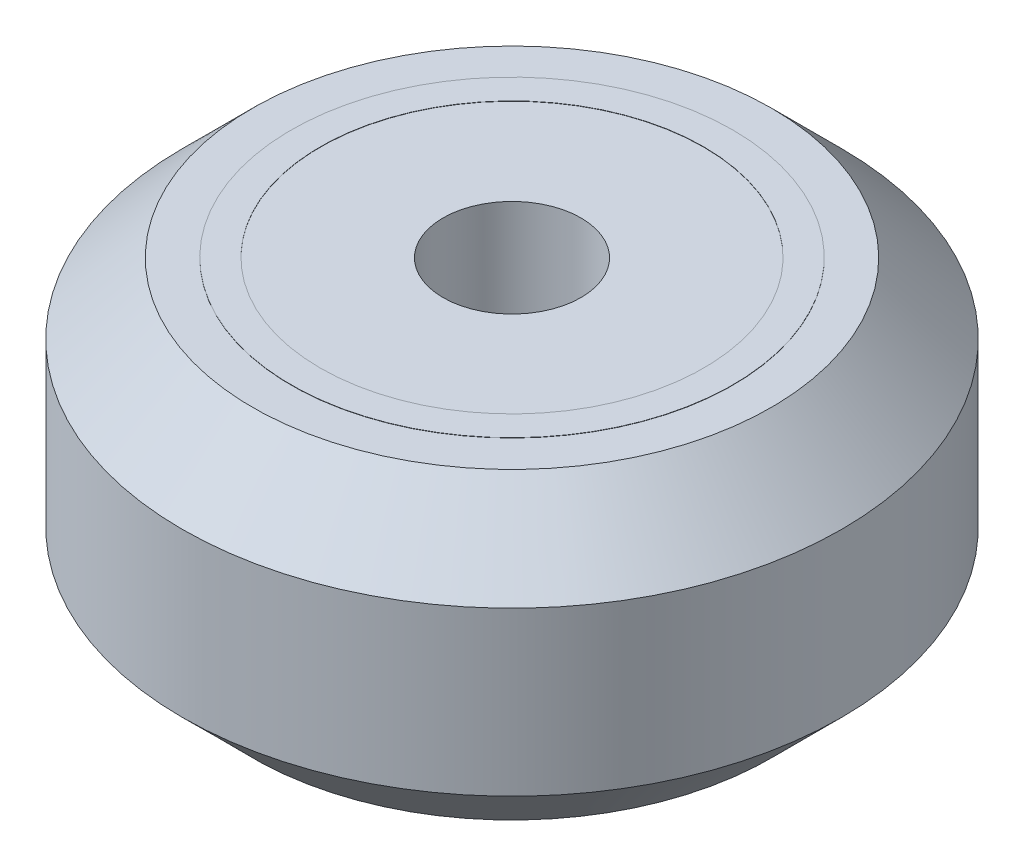
ISO-10303-21;
HEADER;
FILE_DESCRIPTION(('STEP AP214'),'2;1');
FILE_NAME('part.step','',(''),(''),'','','');
FILE_SCHEMA(('AUTOMOTIVE_DESIGN { 1 0 10303 214 1 1 1 1 }'));
ENDSEC;
DATA;
#1=APPLICATION_CONTEXT('core data for automotive mechanical design processes');
#2=APPLICATION_PROTOCOL_DEFINITION('international standard','automotive_design',2000,#1);
#3=PRODUCT_CONTEXT('',#1,'mechanical');
#4=PRODUCT('Part','Part','',(#3));
#5=PRODUCT_RELATED_PRODUCT_CATEGORY('part','',(#4));
#6=PRODUCT_DEFINITION_FORMATION('','',#4);
#7=PRODUCT_DEFINITION_CONTEXT('part definition',#1,'design');
#8=PRODUCT_DEFINITION('design','',#6,#7);
#9=PRODUCT_DEFINITION_SHAPE('','',#8);
#10=(LENGTH_UNIT() NAMED_UNIT(*) SI_UNIT(.MILLI.,.METRE.));
#11=(NAMED_UNIT(*) PLANE_ANGLE_UNIT() SI_UNIT($,.RADIAN.));
#12=(NAMED_UNIT(*) SI_UNIT($,.STERADIAN.) SOLID_ANGLE_UNIT());
#13=UNCERTAINTY_MEASURE_WITH_UNIT(LENGTH_MEASURE(1.E-05),#10,'distance_accuracy_value','');
#14=(GEOMETRIC_REPRESENTATION_CONTEXT(3) GLOBAL_UNCERTAINTY_ASSIGNED_CONTEXT((#13)) GLOBAL_UNIT_ASSIGNED_CONTEXT((#10,
#11,#12)) REPRESENTATION_CONTEXT('',''));
#15=CARTESIAN_POINT('',(0.,0.,0.));
#16=DIRECTION('',(0.,0.,1.));
#17=DIRECTION('',(1.,0.,0.));
#18=AXIS2_PLACEMENT_3D('',#15,#16,#17);
#19=CARTESIAN_POINT('',(0.,-5.51,0.));
#20=DIRECTION('',(0.,1.,0.));
#21=DIRECTION('',(0.,0.,1.));
#22=AXIS2_PLACEMENT_3D('',#19,#20,#21);
#23=CYLINDRICAL_SURFACE('',#22,2.5);
#24=CARTESIAN_POINT('',(0.,-5.51,0.));
#25=DIRECTION('',(0.,-1.,0.));
#26=DIRECTION('',(0.,0.,-1.));
#27=AXIS2_PLACEMENT_3D('',#24,#25,#26);
#28=CIRCLE('',#27,2.5);
#29=CARTESIAN_POINT('',(0.,-5.51,2.5));
#30=VERTEX_POINT('',#29);
#31=EDGE_CURVE('E12',#30,#30,#28,.F.);
#32=CARTESIAN_POINT('',(0.,-5.5,0.));
#33=DIRECTION('',(0.,-1.,0.));
#34=DIRECTION('',(0.,0.,-1.));
#35=AXIS2_PLACEMENT_3D('',#32,#33,#34);
#36=CIRCLE('',#35,2.5);
#37=CARTESIAN_POINT('',(0.,-5.5,2.5));
#38=VERTEX_POINT('',#37);
#39=EDGE_CURVE('E70',#38,#38,#36,.F.);
#40=CARTESIAN_POINT('',(0.,-5.51,2.5));
#41=CARTESIAN_POINT('',(0.,-5.50989583333333,2.5));
#42=CARTESIAN_POINT('',(0.,-5.50979166666666,2.5));
#43=CARTESIAN_POINT('',(0.,-5.50958333333333,2.5));
#44=CARTESIAN_POINT('',(0.,-5.50947916666666,2.5));
#45=CARTESIAN_POINT('',(0.,-5.50927083333333,2.5));
#46=CARTESIAN_POINT('',(0.,-5.50916666666666,2.5));
#47=CARTESIAN_POINT('',(0.,-5.50895833333333,2.5));
#48=CARTESIAN_POINT('',(0.,-5.50885416666666,2.5));
#49=CARTESIAN_POINT('',(0.,-5.50864583333333,2.5));
#50=CARTESIAN_POINT('',(0.,-5.50854166666666,2.5));
#51=CARTESIAN_POINT('',(0.,-5.50833333333333,2.5));
#52=CARTESIAN_POINT('',(0.,-5.50822916666666,2.5));
#53=CARTESIAN_POINT('',(0.,-5.50802083333333,2.5));
#54=CARTESIAN_POINT('',(0.,-5.50791666666666,2.5));
#55=CARTESIAN_POINT('',(0.,-5.50770833333333,2.5));
#56=CARTESIAN_POINT('',(0.,-5.50760416666667,2.5));
#57=CARTESIAN_POINT('',(0.,-5.50739583333333,2.5));
#58=CARTESIAN_POINT('',(0.,-5.50729166666666,2.5));
#59=CARTESIAN_POINT('',(0.,-5.50708333333333,2.5));
#60=CARTESIAN_POINT('',(0.,-5.50697916666666,2.5));
#61=CARTESIAN_POINT('',(0.,-5.50677083333333,2.5));
#62=CARTESIAN_POINT('',(0.,-5.50666666666667,2.5));
#63=CARTESIAN_POINT('',(0.,-5.50645833333333,2.5));
#64=CARTESIAN_POINT('',(0.,-5.50635416666666,2.5));
#65=CARTESIAN_POINT('',(0.,-5.50614583333333,2.5));
#66=CARTESIAN_POINT('',(0.,-5.50604166666666,2.5));
#67=CARTESIAN_POINT('',(0.,-5.50583333333333,2.5));
#68=CARTESIAN_POINT('',(0.,-5.50572916666667,2.5));
#69=CARTESIAN_POINT('',(0.,-5.50552083333333,2.5));
#70=CARTESIAN_POINT('',(0.,-5.50541666666666,2.5));
#71=CARTESIAN_POINT('',(0.,-5.50520833333333,2.5));
#72=CARTESIAN_POINT('',(0.,-5.50510416666666,2.5));
#73=CARTESIAN_POINT('',(0.,-5.50489583333333,2.5));
#74=CARTESIAN_POINT('',(0.,-5.50479166666666,2.5));
#75=CARTESIAN_POINT('',(0.,-5.50458333333333,2.5));
#76=CARTESIAN_POINT('',(0.,-5.50447916666666,2.5));
#77=CARTESIAN_POINT('',(0.,-5.50427083333333,2.5));
#78=CARTESIAN_POINT('',(0.,-5.50416666666666,2.5));
#79=CARTESIAN_POINT('',(0.,-5.50395833333333,2.5));
#80=CARTESIAN_POINT('',(0.,-5.50385416666666,2.5));
#81=CARTESIAN_POINT('',(0.,-5.50364583333333,2.5));
#82=CARTESIAN_POINT('',(0.,-5.50354166666666,2.5));
#83=CARTESIAN_POINT('',(0.,-5.50333333333333,2.5));
#84=CARTESIAN_POINT('',(0.,-5.50322916666666,2.5));
#85=CARTESIAN_POINT('',(0.,-5.50302083333333,2.5));
#86=CARTESIAN_POINT('',(0.,-5.50291666666666,2.5));
#87=CARTESIAN_POINT('',(0.,-5.50270833333333,2.5));
#88=CARTESIAN_POINT('',(0.,-5.50260416666667,2.5));
#89=CARTESIAN_POINT('',(0.,-5.50239583333333,2.5));
#90=CARTESIAN_POINT('',(0.,-5.50229166666666,2.5));
#91=CARTESIAN_POINT('',(0.,-5.50208333333333,2.5));
#92=CARTESIAN_POINT('',(0.,-5.50197916666666,2.5));
#93=CARTESIAN_POINT('',(0.,-5.50177083333333,2.5));
#94=CARTESIAN_POINT('',(0.,-5.50166666666667,2.5));
#95=CARTESIAN_POINT('',(0.,-5.50145833333333,2.5));
#96=CARTESIAN_POINT('',(0.,-5.50135416666666,2.5));
#97=CARTESIAN_POINT('',(0.,-5.50114583333333,2.5));
#98=CARTESIAN_POINT('',(0.,-5.50104166666666,2.5));
#99=CARTESIAN_POINT('',(0.,-5.50083333333333,2.5));
#100=CARTESIAN_POINT('',(0.,-5.50072916666667,2.5));
#101=CARTESIAN_POINT('',(0.,-5.50052083333333,2.5));
#102=CARTESIAN_POINT('',(0.,-5.50041666666666,2.5));
#103=CARTESIAN_POINT('',(0.,-5.50020833333333,2.5));
#104=CARTESIAN_POINT('',(0.,-5.50010416666667,2.5));
#105=CARTESIAN_POINT('',(0.,-5.5,2.5));
#106=B_SPLINE_CURVE_WITH_KNOTS('',3,(#40,#41,#42,#43,#44,#45,#46,#47,#48,#49,#50,#51,#52,#53,
#54,#55,#56,#57,#58,#59,#60,#61,#62,#63,#64,#65,#66,#67,#68,#69,#70,#71,#72,#73,#74,#75,#76,#77,
#78,#79,#80,#81,#82,#83,#84,#85,#86,#87,#88,#89,#90,#91,#92,#93,#94,#95,#96,#97,#98,#99,#100,
#101,#102,#103,#104,#105),.UNSPECIFIED.,.F.,.F.,(4,2,2,2,2,2,2,2,2,2,2,2,2,2,2,2,2,2,2,2,2,2,2,
2,2,2,2,2,2,2,2,2,4),(0.,0.000312499999999445,0.000624999999999758,0.000937499999999203,
0.00124999999999952,0.00156249999999983,0.00187499999999927,0.00218749999999959,
0.00249999999999903,0.00281249999999934,0.00312499999999966,0.0034374999999991,
0.00374999999999941,0.00406249999999973,0.00437499999999917,0.00468749999999948,
0.00499999999999893,0.00531249999999924,0.00562499999999955,0.005937499999999,
0.00624999999999931,0.00656249999999962,0.00687499999999907,0.00718749999999938,
0.00749999999999883,0.00781249999999914,0.00812499999999945,0.0084374999999989,
0.00874999999999921,0.00906249999999952,0.00937499999999897,0.00968749999999928,
0.00999999999999873),.UNSPECIFIED.);
#107=EDGE_CURVE('BSEAM67',#30,#38,#106,.T.);
#108=ORIENTED_EDGE('',*,*,#31,.T.);
#109=ORIENTED_EDGE('',*,*,#39,.F.);
#110=ORIENTED_EDGE('',*,*,#107,.T.);
#111=ORIENTED_EDGE('',*,*,#107,.F.);
#112=EDGE_LOOP('',(#108,#110,#109,#111));
#113=FACE_BOUND('',#112,.T.);
#114=ADVANCED_FACE('F67',(#113),#23,.T.);
#115=CARTESIAN_POINT('',(0.,-5.51,0.));
#116=DIRECTION('',(0.,-1.,0.));
#117=DIRECTION('',(0.,0.,-1.));
#118=AXIS2_PLACEMENT_3D('',#115,#116,#117);
#119=PLANE('',#118);
#120=ORIENTED_EDGE('',*,*,#31,.F.);
#121=EDGE_LOOP('',(#120));
#122=FACE_BOUND('',#121,.T.);
#123=ADVANCED_FACE('F82',(#122),#119,.T.);
#124=CARTESIAN_POINT('',(0.,-5.5,0.));
#125=DIRECTION('',(0.,-1.,0.));
#126=DIRECTION('',(0.,0.,-1.));
#127=AXIS2_PLACEMENT_3D('',#124,#125,#126);
#128=PLANE('',#127);
#129=ORIENTED_EDGE('',*,*,#39,.T.);
#130=EDGE_LOOP('',(#129));
#131=FACE_BOUND('',#130,.T.);
#132=ADVANCED_FACE('F79',(#131),#128,.F.);
#133=CLOSED_SHELL('',(#114,#123,#132));
#134=MANIFOLD_SOLID_BREP('B2',#133);
#135=CARTESIAN_POINT('',(9.395,-5.5,0.));
#136=DIRECTION('',(0.,-1.,0.));
#137=DIRECTION('',(0.,0.,-1.));
#138=AXIS2_PLACEMENT_3D('',#135,#136,#137);
#139=PLANE('',#138);
#140=CARTESIAN_POINT('',(0.,-5.5,0.));
#141=DIRECTION('',(0.,-1.,0.));
#142=DIRECTION('',(0.,0.,-1.));
#143=AXIS2_PLACEMENT_3D('',#140,#141,#142);
#144=CIRCLE('',#143,2.5);
#145=CARTESIAN_POINT('',(0.,-5.5,-2.5));
#146=VERTEX_POINT('',#145);
#147=EDGE_CURVE('E136',#146,#146,#144,.T.);
#148=ORIENTED_EDGE('',*,*,#147,.F.);
#149=EDGE_LOOP('',(#148));
#150=FACE_BOUND('',#149,.T.);
#151=CARTESIAN_POINT('',(0.,-5.5,0.));
#152=DIRECTION('',(0.,-1.,0.));
#153=DIRECTION('',(0.,0.,-1.));
#154=AXIS2_PLACEMENT_3D('',#151,#152,#153);
#155=CIRCLE('',#154,6.945);
#156=CARTESIAN_POINT('',(0.,-5.5,6.945));
#157=VERTEX_POINT('',#156);
#158=EDGE_CURVE('E66',#157,#157,#155,.F.);
#159=ORIENTED_EDGE('',*,*,#158,.F.);
#160=EDGE_LOOP('',(#159));
#161=FACE_BOUND('',#160,.T.);
#162=ADVANCED_FACE('F110',(#150,#161),#139,.T.);
#163=CARTESIAN_POINT('',(0.,5.5,0.));
#164=DIRECTION('',(0.,1.,0.));
#165=DIRECTION('',(0.,0.,1.));
#166=AXIS2_PLACEMENT_3D('',#163,#164,#165);
#167=PLANE('',#166);
#168=CARTESIAN_POINT('',(0.,5.5,0.));
#169=DIRECTION('',(0.,1.,0.));
#170=DIRECTION('',(0.,0.,1.));
#171=AXIS2_PLACEMENT_3D('',#168,#169,#170);
#172=CIRCLE('',#171,2.5);
#173=CARTESIAN_POINT('',(0.,5.5,2.5));
#174=VERTEX_POINT('',#173);
#175=EDGE_CURVE('E137',#174,#174,#172,.F.);
#176=ORIENTED_EDGE('',*,*,#175,.T.);
#177=EDGE_LOOP('',(#176));
#178=FACE_BOUND('',#177,.T.);
#179=CARTESIAN_POINT('',(0.,5.5,0.));
#180=DIRECTION('',(0.,1.,0.));
#181=DIRECTION('',(0.,0.,1.));
#182=AXIS2_PLACEMENT_3D('',#179,#180,#181);
#183=CIRCLE('',#182,6.945);
#184=CARTESIAN_POINT('',(0.,5.5,-6.945));
#185=VERTEX_POINT('',#184);
#186=EDGE_CURVE('E117',#185,#185,#183,.F.);
#187=ORIENTED_EDGE('',*,*,#186,.F.);
#188=EDGE_LOOP('',(#187));
#189=FACE_BOUND('',#188,.T.);
#190=ADVANCED_FACE('F182',(#178,#189),#167,.T.);
#191=CARTESIAN_POINT('',(0.,5.5,0.));
#192=DIRECTION('',(0.,1.,0.));
#193=DIRECTION('',(0.,0.,1.));
#194=AXIS2_PLACEMENT_3D('',#191,#192,#193);
#195=CIRCLE('',#194,8.);
#196=CARTESIAN_POINT('',(0.,5.5,-8.));
#197=VERTEX_POINT('',#196);
#198=EDGE_CURVE('E143',#197,#197,#195,.T.);
#199=ORIENTED_EDGE('',*,*,#198,.F.);
#200=EDGE_LOOP('',(#199));
#201=FACE_BOUND('',#200,.T.);
#202=CARTESIAN_POINT('',(0.,5.5,0.));
#203=DIRECTION('',(0.,-1.,0.));
#204=DIRECTION('',(0.,0.,-1.));
#205=AXIS2_PLACEMENT_3D('',#202,#203,#204);
#206=CIRCLE('',#205,9.395);
#207=CARTESIAN_POINT('',(0.,5.5,-9.395));
#208=VERTEX_POINT('',#207);
#209=EDGE_CURVE('E121',#208,#208,#206,.T.);
#210=ORIENTED_EDGE('',*,*,#209,.F.);
#211=EDGE_LOOP('',(#210));
#212=FACE_BOUND('',#211,.T.);
#213=ADVANCED_FACE('F112',(#201,#212),#167,.T.);
#214=CARTESIAN_POINT('',(0.,2.95000000000001,0.));
#215=DIRECTION('',(0.,-1.,0.));
#216=DIRECTION('',(0.,0.,-1.));
#217=AXIS2_PLACEMENT_3D('',#214,#215,#216);
#218=CONICAL_SURFACE('',#217,11.945,0.78539816339745);
#219=ORIENTED_EDGE('',*,*,#209,.T.);
#220=EDGE_LOOP('',(#219));
#221=FACE_BOUND('',#220,.T.);
#222=CARTESIAN_POINT('',(0.,2.95000000000001,0.));
#223=DIRECTION('',(0.,-1.,0.));
#224=DIRECTION('',(0.,0.,-1.));
#225=AXIS2_PLACEMENT_3D('',#222,#223,#224);
#226=CIRCLE('',#225,11.945);
#227=CARTESIAN_POINT('',(0.,2.95000000000001,-11.945));
#228=VERTEX_POINT('',#227);
#229=EDGE_CURVE('E125',#228,#228,#226,.T.);
#230=ORIENTED_EDGE('',*,*,#229,.F.);
#231=EDGE_LOOP('',(#230));
#232=FACE_BOUND('',#231,.T.);
#233=ADVANCED_FACE('F178',(#221,#232),#218,.T.);
#234=CARTESIAN_POINT('',(0.,0.,0.));
#235=DIRECTION('',(0.,-1.,0.));
#236=DIRECTION('',(0.,0.,-1.));
#237=AXIS2_PLACEMENT_3D('',#234,#235,#236);
#238=CYLINDRICAL_SURFACE('',#237,11.945);
#239=ORIENTED_EDGE('',*,*,#229,.T.);
#240=EDGE_LOOP('',(#239));
#241=FACE_BOUND('',#240,.T.);
#242=CARTESIAN_POINT('',(0.,-2.95,0.));
#243=DIRECTION('',(0.,-1.,0.));
#244=DIRECTION('',(0.,0.,-1.));
#245=AXIS2_PLACEMENT_3D('',#242,#243,#244);
#246=CIRCLE('',#245,11.945);
#247=CARTESIAN_POINT('',(0.,-2.95,-11.945));
#248=VERTEX_POINT('',#247);
#249=EDGE_CURVE('E130',#248,#248,#246,.T.);
#250=ORIENTED_EDGE('',*,*,#249,.F.);
#251=EDGE_LOOP('',(#250));
#252=FACE_BOUND('',#251,.T.);
#253=ADVANCED_FACE('F172',(#241,#252),#238,.T.);
#254=CARTESIAN_POINT('',(0.,-5.5,0.));
#255=DIRECTION('',(0.,1.,0.));
#256=DIRECTION('',(0.,0.,1.));
#257=AXIS2_PLACEMENT_3D('',#254,#255,#256);
#258=CONICAL_SURFACE('',#257,9.395,0.785398163397447);
#259=ORIENTED_EDGE('',*,*,#249,.T.);
#260=EDGE_LOOP('',(#259));
#261=FACE_BOUND('',#260,.T.);
#262=CARTESIAN_POINT('',(0.,-5.5,0.));
#263=DIRECTION('',(0.,-1.,0.));
#264=DIRECTION('',(0.,0.,-1.));
#265=AXIS2_PLACEMENT_3D('',#262,#263,#264);
#266=CIRCLE('',#265,9.395);
#267=CARTESIAN_POINT('',(0.,-5.5,-9.395));
#268=VERTEX_POINT('',#267);
#269=EDGE_CURVE('E133',#268,#268,#266,.T.);
#270=ORIENTED_EDGE('',*,*,#269,.F.);
#271=EDGE_LOOP('',(#270));
#272=FACE_BOUND('',#271,.T.);
#273=ADVANCED_FACE('F167',(#261,#272),#258,.T.);
#274=CARTESIAN_POINT('',(0.,-5.5,0.));
#275=DIRECTION('',(0.,-1.,0.));
#276=DIRECTION('',(0.,0.,-1.));
#277=AXIS2_PLACEMENT_3D('',#274,#275,#276);
#278=CIRCLE('',#277,8.);
#279=CARTESIAN_POINT('',(0.,-5.5,8.));
#280=VERTEX_POINT('',#279);
#281=EDGE_CURVE('E154',#280,#280,#278,.T.);
#282=ORIENTED_EDGE('',*,*,#281,.F.);
#283=EDGE_LOOP('',(#282));
#284=FACE_BOUND('',#283,.T.);
#285=ORIENTED_EDGE('',*,*,#269,.T.);
#286=EDGE_LOOP('',(#285));
#287=FACE_BOUND('',#286,.T.);
#288=ADVANCED_FACE('F163',(#284,#287),#139,.T.);
#289=CARTESIAN_POINT('',(0.,5.501,0.));
#290=DIRECTION('',(0.,-1.,0.));
#291=DIRECTION('',(0.,0.,-1.));
#292=AXIS2_PLACEMENT_3D('',#289,#290,#291);
#293=CYLINDRICAL_SURFACE('',#292,2.5);
#294=ORIENTED_EDGE('',*,*,#175,.F.);
#295=EDGE_LOOP('',(#294));
#296=FACE_BOUND('',#295,.T.);
#297=ORIENTED_EDGE('',*,*,#147,.T.);
#298=EDGE_LOOP('',(#297));
#299=FACE_BOUND('',#298,.T.);
#300=ADVANCED_FACE('F166',(#296,#299),#293,.F.);
#301=CARTESIAN_POINT('',(0.,5.51,0.));
#302=DIRECTION('',(0.,-1.,0.));
#303=DIRECTION('',(0.,0.,-1.));
#304=AXIS2_PLACEMENT_3D('',#301,#302,#303);
#305=CYLINDRICAL_SURFACE('',#304,6.945);
#306=CARTESIAN_POINT('',(0.,5.51,0.));
#307=DIRECTION('',(0.,1.,0.));
#308=DIRECTION('',(0.,0.,1.));
#309=AXIS2_PLACEMENT_3D('',#306,#307,#308);
#310=CIRCLE('',#309,6.945);
#311=CARTESIAN_POINT('',(0.,5.51,-6.945));
#312=VERTEX_POINT('',#311);
#313=EDGE_CURVE('E146',#312,#312,#310,.T.);
#314=CARTESIAN_POINT('',(0.,5.51,-6.945));
#315=CARTESIAN_POINT('',(0.,5.50989583333333,-6.945));
#316=CARTESIAN_POINT('',(0.,5.50979166666667,-6.945));
#317=CARTESIAN_POINT('',(0.,5.50958333333333,-6.945));
#318=CARTESIAN_POINT('',(0.,5.50947916666667,-6.945));
#319=CARTESIAN_POINT('',(0.,5.50927083333333,-6.945));
#320=CARTESIAN_POINT('',(0.,5.50916666666667,-6.945));
#321=CARTESIAN_POINT('',(0.,5.50895833333333,-6.945));
#322=CARTESIAN_POINT('',(0.,5.50885416666667,-6.945));
#323=CARTESIAN_POINT('',(0.,5.50864583333333,-6.945));
#324=CARTESIAN_POINT('',(0.,5.50854166666667,-6.945));
#325=CARTESIAN_POINT('',(0.,5.50833333333333,-6.945));
#326=CARTESIAN_POINT('',(0.,5.50822916666667,-6.945));
#327=CARTESIAN_POINT('',(0.,5.50802083333333,-6.945));
#328=CARTESIAN_POINT('',(0.,5.50791666666667,-6.945));
#329=CARTESIAN_POINT('',(0.,5.50770833333333,-6.945));
#330=CARTESIAN_POINT('',(0.,5.50760416666667,-6.945));
#331=CARTESIAN_POINT('',(0.,5.50739583333333,-6.945));
#332=CARTESIAN_POINT('',(0.,5.50729166666667,-6.945));
#333=CARTESIAN_POINT('',(0.,5.50708333333333,-6.945));
#334=CARTESIAN_POINT('',(0.,5.50697916666667,-6.945));
#335=CARTESIAN_POINT('',(0.,5.50677083333333,-6.945));
#336=CARTESIAN_POINT('',(0.,5.50666666666667,-6.945));
#337=CARTESIAN_POINT('',(0.,5.50645833333333,-6.945));
#338=CARTESIAN_POINT('',(0.,5.50635416666667,-6.945));
#339=CARTESIAN_POINT('',(0.,5.50614583333333,-6.945));
#340=CARTESIAN_POINT('',(0.,5.50604166666666,-6.945));
#341=CARTESIAN_POINT('',(0.,5.50583333333333,-6.945));
#342=CARTESIAN_POINT('',(0.,5.50572916666667,-6.945));
#343=CARTESIAN_POINT('',(0.,5.50552083333333,-6.945));
#344=CARTESIAN_POINT('',(0.,5.50541666666667,-6.945));
#345=CARTESIAN_POINT('',(0.,5.50520833333333,-6.945));
#346=CARTESIAN_POINT('',(0.,5.50510416666666,-6.945));
#347=CARTESIAN_POINT('',(0.,5.50489583333333,-6.945));
#348=CARTESIAN_POINT('',(0.,5.50479166666667,-6.945));
#349=CARTESIAN_POINT('',(0.,5.50458333333333,-6.945));
#350=CARTESIAN_POINT('',(0.,5.50447916666667,-6.945));
#351=CARTESIAN_POINT('',(0.,5.50427083333333,-6.945));
#352=CARTESIAN_POINT('',(0.,5.50416666666667,-6.945));
#353=CARTESIAN_POINT('',(0.,5.50395833333333,-6.945));
#354=CARTESIAN_POINT('',(0.,5.50385416666667,-6.945));
#355=CARTESIAN_POINT('',(0.,5.50364583333333,-6.945));
#356=CARTESIAN_POINT('',(0.,5.50354166666667,-6.945));
#357=CARTESIAN_POINT('',(0.,5.50333333333333,-6.945));
#358=CARTESIAN_POINT('',(0.,5.50322916666667,-6.945));
#359=CARTESIAN_POINT('',(0.,5.50302083333333,-6.945));
#360=CARTESIAN_POINT('',(0.,5.50291666666667,-6.945));
#361=CARTESIAN_POINT('',(0.,5.50270833333333,-6.945));
#362=CARTESIAN_POINT('',(0.,5.50260416666667,-6.945));
#363=CARTESIAN_POINT('',(0.,5.50239583333333,-6.945));
#364=CARTESIAN_POINT('',(0.,5.50229166666667,-6.945));
#365=CARTESIAN_POINT('',(0.,5.50208333333333,-6.945));
#366=CARTESIAN_POINT('',(0.,5.50197916666667,-6.945));
#367=CARTESIAN_POINT('',(0.,5.50177083333333,-6.945));
#368=CARTESIAN_POINT('',(0.,5.50166666666667,-6.945));
#369=CARTESIAN_POINT('',(0.,5.50145833333333,-6.945));
#370=CARTESIAN_POINT('',(0.,5.50135416666667,-6.945));
#371=CARTESIAN_POINT('',(0.,5.50114583333333,-6.945));
#372=CARTESIAN_POINT('',(0.,5.50104166666667,-6.945));
#373=CARTESIAN_POINT('',(0.,5.50083333333333,-6.945));
#374=CARTESIAN_POINT('',(0.,5.50072916666667,-6.945));
#375=CARTESIAN_POINT('',(0.,5.50052083333333,-6.945));
#376=CARTESIAN_POINT('',(0.,5.50041666666667,-6.945));
#377=CARTESIAN_POINT('',(0.,5.50020833333333,-6.945));
#378=CARTESIAN_POINT('',(0.,5.50010416666667,-6.945));
#379=CARTESIAN_POINT('',(0.,5.5,-6.945));
#380=B_SPLINE_CURVE_WITH_KNOTS('',3,(#314,#315,#316,#317,#318,#319,#320,#321,#322,#323,#324,
#325,#326,#327,#328,#329,#330,#331,#332,#333,#334,#335,#336,#337,#338,#339,#340,#341,#342,#343,
#344,#345,#346,#347,#348,#349,#350,#351,#352,#353,#354,#355,#356,#357,#358,#359,#360,#361,#362,
#363,#364,#365,#366,#367,#368,#369,#370,#371,#372,#373,#374,#375,#376,#377,#378,#379),
.UNSPECIFIED.,.F.,.F.,(4,2,2,2,2,2,2,2,2,2,2,2,2,2,2,2,2,2,2,2,2,2,2,2,2,2,2,2,2,2,2,2,4),(0.,
0.000312500000000313,0.000625000000000625,0.00093750000000007,0.00125000000000038,
0.0015625000000007,0.00187500000000014,0.00218750000000045,0.00250000000000077,
0.00281250000000021,0.00312500000000052,0.00343749999999997,0.00375000000000028,
0.00406250000000059,0.00437500000000004,0.00468750000000035,0.00500000000000066,
0.00531250000000011,0.00562500000000042,0.00593749999999987,0.00625000000000018,
0.00656250000000049,0.00687499999999994,0.00718750000000025,0.00750000000000056,
0.00781250000000001,0.00812500000000032,0.00843749999999976,0.00875000000000008,
0.00906250000000039,0.00937499999999983,0.00968750000000015,0.0100000000000005),.UNSPECIFIED.);
#381=EDGE_CURVE('BSEAM193',#312,#185,#380,.T.);
#382=ORIENTED_EDGE('',*,*,#313,.T.);
#383=ORIENTED_EDGE('',*,*,#186,.T.);
#384=ORIENTED_EDGE('',*,*,#381,.T.);
#385=ORIENTED_EDGE('',*,*,#381,.F.);
#386=EDGE_LOOP('',(#382,#384,#383,#385));
#387=FACE_BOUND('',#386,.T.);
#388=ADVANCED_FACE('F193',(#387),#305,.F.);
#389=CARTESIAN_POINT('',(0.,5.51,0.));
#390=DIRECTION('',(0.,-1.,0.));
#391=DIRECTION('',(0.,0.,-1.));
#392=AXIS2_PLACEMENT_3D('',#389,#390,#391);
#393=CYLINDRICAL_SURFACE('',#392,8.);
#394=CARTESIAN_POINT('',(0.,5.51,0.));
#395=DIRECTION('',(0.,1.,0.));
#396=DIRECTION('',(0.,0.,1.));
#397=AXIS2_PLACEMENT_3D('',#394,#395,#396);
#398=CIRCLE('',#397,8.);
#399=CARTESIAN_POINT('',(0.,5.51,-8.));
#400=VERTEX_POINT('',#399);
#401=EDGE_CURVE('E140',#400,#400,#398,.T.);
#402=CARTESIAN_POINT('',(0.,5.51,-8.));
#403=CARTESIAN_POINT('',(0.,5.50989583333333,-8.));
#404=CARTESIAN_POINT('',(0.,5.50979166666667,-8.));
#405=CARTESIAN_POINT('',(0.,5.50958333333333,-8.));
#406=CARTESIAN_POINT('',(0.,5.50947916666667,-8.));
#407=CARTESIAN_POINT('',(0.,5.50927083333333,-8.));
#408=CARTESIAN_POINT('',(0.,5.50916666666667,-8.));
#409=CARTESIAN_POINT('',(0.,5.50895833333333,-8.));
#410=CARTESIAN_POINT('',(0.,5.50885416666667,-8.));
#411=CARTESIAN_POINT('',(0.,5.50864583333333,-8.));
#412=CARTESIAN_POINT('',(0.,5.50854166666667,-8.));
#413=CARTESIAN_POINT('',(0.,5.50833333333333,-8.));
#414=CARTESIAN_POINT('',(0.,5.50822916666667,-8.));
#415=CARTESIAN_POINT('',(0.,5.50802083333333,-8.));
#416=CARTESIAN_POINT('',(0.,5.50791666666667,-8.));
#417=CARTESIAN_POINT('',(0.,5.50770833333333,-8.));
#418=CARTESIAN_POINT('',(0.,5.50760416666667,-8.));
#419=CARTESIAN_POINT('',(0.,5.50739583333333,-8.));
#420=CARTESIAN_POINT('',(0.,5.50729166666667,-8.));
#421=CARTESIAN_POINT('',(0.,5.50708333333333,-8.));
#422=CARTESIAN_POINT('',(0.,5.50697916666667,-8.));
#423=CARTESIAN_POINT('',(0.,5.50677083333333,-8.));
#424=CARTESIAN_POINT('',(0.,5.50666666666667,-8.));
#425=CARTESIAN_POINT('',(0.,5.50645833333333,-8.));
#426=CARTESIAN_POINT('',(0.,5.50635416666667,-8.));
#427=CARTESIAN_POINT('',(0.,5.50614583333333,-8.));
#428=CARTESIAN_POINT('',(0.,5.50604166666666,-8.));
#429=CARTESIAN_POINT('',(0.,5.50583333333333,-8.));
#430=CARTESIAN_POINT('',(0.,5.50572916666667,-8.));
#431=CARTESIAN_POINT('',(0.,5.50552083333333,-8.));
#432=CARTESIAN_POINT('',(0.,5.50541666666667,-8.));
#433=CARTESIAN_POINT('',(0.,5.50520833333333,-8.));
#434=CARTESIAN_POINT('',(0.,5.50510416666666,-8.));
#435=CARTESIAN_POINT('',(0.,5.50489583333333,-8.));
#436=CARTESIAN_POINT('',(0.,5.50479166666667,-8.));
#437=CARTESIAN_POINT('',(0.,5.50458333333333,-8.));
#438=CARTESIAN_POINT('',(0.,5.50447916666667,-8.));
#439=CARTESIAN_POINT('',(0.,5.50427083333333,-8.));
#440=CARTESIAN_POINT('',(0.,5.50416666666667,-8.));
#441=CARTESIAN_POINT('',(0.,5.50395833333333,-8.));
#442=CARTESIAN_POINT('',(0.,5.50385416666667,-8.));
#443=CARTESIAN_POINT('',(0.,5.50364583333333,-8.));
#444=CARTESIAN_POINT('',(0.,5.50354166666667,-8.));
#445=CARTESIAN_POINT('',(0.,5.50333333333333,-8.));
#446=CARTESIAN_POINT('',(0.,5.50322916666667,-8.));
#447=CARTESIAN_POINT('',(0.,5.50302083333333,-8.));
#448=CARTESIAN_POINT('',(0.,5.50291666666667,-8.));
#449=CARTESIAN_POINT('',(0.,5.50270833333333,-8.));
#450=CARTESIAN_POINT('',(0.,5.50260416666667,-8.));
#451=CARTESIAN_POINT('',(0.,5.50239583333333,-8.));
#452=CARTESIAN_POINT('',(0.,5.50229166666667,-8.));
#453=CARTESIAN_POINT('',(0.,5.50208333333333,-8.));
#454=CARTESIAN_POINT('',(0.,5.50197916666667,-8.));
#455=CARTESIAN_POINT('',(0.,5.50177083333333,-8.));
#456=CARTESIAN_POINT('',(0.,5.50166666666667,-8.));
#457=CARTESIAN_POINT('',(0.,5.50145833333333,-8.));
#458=CARTESIAN_POINT('',(0.,5.50135416666667,-8.));
#459=CARTESIAN_POINT('',(0.,5.50114583333333,-8.));
#460=CARTESIAN_POINT('',(0.,5.50104166666667,-8.));
#461=CARTESIAN_POINT('',(0.,5.50083333333333,-8.));
#462=CARTESIAN_POINT('',(0.,5.50072916666667,-8.));
#463=CARTESIAN_POINT('',(0.,5.50052083333333,-8.));
#464=CARTESIAN_POINT('',(0.,5.50041666666667,-8.));
#465=CARTESIAN_POINT('',(0.,5.50020833333333,-8.));
#466=CARTESIAN_POINT('',(0.,5.50010416666667,-8.));
#467=CARTESIAN_POINT('',(0.,5.5,-8.));
#468=B_SPLINE_CURVE_WITH_KNOTS('',3,(#402,#403,#404,#405,#406,#407,#408,#409,#410,#411,#412,
#413,#414,#415,#416,#417,#418,#419,#420,#421,#422,#423,#424,#425,#426,#427,#428,#429,#430,#431,
#432,#433,#434,#435,#436,#437,#438,#439,#440,#441,#442,#443,#444,#445,#446,#447,#448,#449,#450,
#451,#452,#453,#454,#455,#456,#457,#458,#459,#460,#461,#462,#463,#464,#465,#466,#467),
.UNSPECIFIED.,.F.,.F.,(4,2,2,2,2,2,2,2,2,2,2,2,2,2,2,2,2,2,2,2,2,2,2,2,2,2,2,2,2,2,2,2,4),(0.,
0.000312499999999445,0.000624999999999758,0.000937499999999203,0.00124999999999952,
0.00156249999999983,0.00187499999999927,0.00218749999999959,0.0024999999999999,
0.00281249999999934,0.00312499999999966,0.0034374999999991,0.00374999999999941,
0.00406249999999973,0.00437499999999917,0.00468749999999948,0.0049999999999998,
0.00531249999999924,0.00562499999999955,0.005937499999999,0.00624999999999931,
0.00656249999999962,0.00687499999999907,0.00718749999999938,0.00749999999999969,
0.00781249999999914,0.00812499999999945,0.0084374999999989,0.00874999999999921,
0.00906249999999952,0.00937499999999897,0.00968749999999928,0.00999999999999959),.UNSPECIFIED.);
#469=EDGE_CURVE('BSEAM197',#400,#197,#468,.T.);
#470=ORIENTED_EDGE('',*,*,#401,.F.);
#471=ORIENTED_EDGE('',*,*,#198,.T.);
#472=ORIENTED_EDGE('',*,*,#469,.T.);
#473=ORIENTED_EDGE('',*,*,#469,.F.);
#474=EDGE_LOOP('',(#470,#472,#471,#473));
#475=FACE_BOUND('',#474,.T.);
#476=ADVANCED_FACE('F197',(#475),#393,.T.);
#477=CARTESIAN_POINT('',(0.,5.51,0.));
#478=DIRECTION('',(0.,1.,0.));
#479=DIRECTION('',(0.,0.,1.));
#480=AXIS2_PLACEMENT_3D('',#477,#478,#479);
#481=PLANE('',#480);
#482=ORIENTED_EDGE('',*,*,#313,.F.);
#483=EDGE_LOOP('',(#482));
#484=FACE_BOUND('',#483,.T.);
#485=ORIENTED_EDGE('',*,*,#401,.T.);
#486=EDGE_LOOP('',(#485));
#487=FACE_BOUND('',#486,.T.);
#488=ADVANCED_FACE('F201',(#484,#487),#481,.T.);
#489=CARTESIAN_POINT('',(0.,-5.51,0.));
#490=DIRECTION('',(0.,-1.,0.));
#491=DIRECTION('',(0.,0.,-1.));
#492=AXIS2_PLACEMENT_3D('',#489,#490,#491);
#493=PLANE('',#492);
#494=CARTESIAN_POINT('',(0.,-5.51,0.));
#495=DIRECTION('',(0.,-1.,0.));
#496=DIRECTION('',(0.,0.,-1.));
#497=AXIS2_PLACEMENT_3D('',#494,#495,#496);
#498=CIRCLE('',#497,8.);
#499=CARTESIAN_POINT('',(0.,-5.51,8.));
#500=VERTEX_POINT('',#499);
#501=EDGE_CURVE('E155',#500,#500,#498,.T.);
#502=ORIENTED_EDGE('',*,*,#501,.T.);
#503=EDGE_LOOP('',(#502));
#504=FACE_BOUND('',#503,.T.);
#505=CARTESIAN_POINT('',(0.,-5.51,0.));
#506=DIRECTION('',(0.,-1.,0.));
#507=DIRECTION('',(0.,0.,-1.));
#508=AXIS2_PLACEMENT_3D('',#505,#506,#507);
#509=CIRCLE('',#508,6.945);
#510=CARTESIAN_POINT('',(0.,-5.51,6.945));
#511=VERTEX_POINT('',#510);
#512=EDGE_CURVE('E147',#511,#511,#509,.T.);
#513=ORIENTED_EDGE('',*,*,#512,.F.);
#514=EDGE_LOOP('',(#513));
#515=FACE_BOUND('',#514,.T.);
#516=ADVANCED_FACE('F205',(#504,#515),#493,.T.);
#517=CARTESIAN_POINT('',(0.,-5.51,0.));
#518=DIRECTION('',(0.,1.,0.));
#519=DIRECTION('',(0.,0.,1.));
#520=AXIS2_PLACEMENT_3D('',#517,#518,#519);
#521=CYLINDRICAL_SURFACE('',#520,8.);
#522=CARTESIAN_POINT('',(0.,-5.51,8.));
#523=CARTESIAN_POINT('',(0.,-5.50989583333333,8.));
#524=CARTESIAN_POINT('',(0.,-5.50979166666666,8.));
#525=CARTESIAN_POINT('',(0.,-5.50958333333333,8.));
#526=CARTESIAN_POINT('',(0.,-5.50947916666666,8.));
#527=CARTESIAN_POINT('',(0.,-5.50927083333333,8.));
#528=CARTESIAN_POINT('',(0.,-5.50916666666666,8.));
#529=CARTESIAN_POINT('',(0.,-5.50895833333333,8.));
#530=CARTESIAN_POINT('',(0.,-5.50885416666666,8.));
#531=CARTESIAN_POINT('',(0.,-5.50864583333333,8.));
#532=CARTESIAN_POINT('',(0.,-5.50854166666666,8.));
#533=CARTESIAN_POINT('',(0.,-5.50833333333333,8.));
#534=CARTESIAN_POINT('',(0.,-5.50822916666666,8.));
#535=CARTESIAN_POINT('',(0.,-5.50802083333333,8.));
#536=CARTESIAN_POINT('',(0.,-5.50791666666666,8.));
#537=CARTESIAN_POINT('',(0.,-5.50770833333333,8.));
#538=CARTESIAN_POINT('',(0.,-5.50760416666667,8.));
#539=CARTESIAN_POINT('',(0.,-5.50739583333333,8.));
#540=CARTESIAN_POINT('',(0.,-5.50729166666666,8.));
#541=CARTESIAN_POINT('',(0.,-5.50708333333333,8.));
#542=CARTESIAN_POINT('',(0.,-5.50697916666666,8.));
#543=CARTESIAN_POINT('',(0.,-5.50677083333333,8.));
#544=CARTESIAN_POINT('',(0.,-5.50666666666667,8.));
#545=CARTESIAN_POINT('',(0.,-5.50645833333333,8.));
#546=CARTESIAN_POINT('',(0.,-5.50635416666666,8.));
#547=CARTESIAN_POINT('',(0.,-5.50614583333333,8.));
#548=CARTESIAN_POINT('',(0.,-5.50604166666666,8.));
#549=CARTESIAN_POINT('',(0.,-5.50583333333333,8.));
#550=CARTESIAN_POINT('',(0.,-5.50572916666667,8.));
#551=CARTESIAN_POINT('',(0.,-5.50552083333333,8.));
#552=CARTESIAN_POINT('',(0.,-5.50541666666666,8.));
#553=CARTESIAN_POINT('',(0.,-5.50520833333333,8.));
#554=CARTESIAN_POINT('',(0.,-5.50510416666666,8.));
#555=CARTESIAN_POINT('',(0.,-5.50489583333333,8.));
#556=CARTESIAN_POINT('',(0.,-5.50479166666666,8.));
#557=CARTESIAN_POINT('',(0.,-5.50458333333333,8.));
#558=CARTESIAN_POINT('',(0.,-5.50447916666666,8.));
#559=CARTESIAN_POINT('',(0.,-5.50427083333333,8.));
#560=CARTESIAN_POINT('',(0.,-5.50416666666666,8.));
#561=CARTESIAN_POINT('',(0.,-5.50395833333333,8.));
#562=CARTESIAN_POINT('',(0.,-5.50385416666666,8.));
#563=CARTESIAN_POINT('',(0.,-5.50364583333333,8.));
#564=CARTESIAN_POINT('',(0.,-5.50354166666666,8.));
#565=CARTESIAN_POINT('',(0.,-5.50333333333333,8.));
#566=CARTESIAN_POINT('',(0.,-5.50322916666666,8.));
#567=CARTESIAN_POINT('',(0.,-5.50302083333333,8.));
#568=CARTESIAN_POINT('',(0.,-5.50291666666666,8.));
#569=CARTESIAN_POINT('',(0.,-5.50270833333333,8.));
#570=CARTESIAN_POINT('',(0.,-5.50260416666667,8.));
#571=CARTESIAN_POINT('',(0.,-5.50239583333333,8.));
#572=CARTESIAN_POINT('',(0.,-5.50229166666666,8.));
#573=CARTESIAN_POINT('',(0.,-5.50208333333333,8.));
#574=CARTESIAN_POINT('',(0.,-5.50197916666666,8.));
#575=CARTESIAN_POINT('',(0.,-5.50177083333333,8.));
#576=CARTESIAN_POINT('',(0.,-5.50166666666667,8.));
#577=CARTESIAN_POINT('',(0.,-5.50145833333333,8.));
#578=CARTESIAN_POINT('',(0.,-5.50135416666666,8.));
#579=CARTESIAN_POINT('',(0.,-5.50114583333333,8.));
#580=CARTESIAN_POINT('',(0.,-5.50104166666666,8.));
#581=CARTESIAN_POINT('',(0.,-5.50083333333333,8.));
#582=CARTESIAN_POINT('',(0.,-5.50072916666667,8.));
#583=CARTESIAN_POINT('',(0.,-5.50052083333333,8.));
#584=CARTESIAN_POINT('',(0.,-5.50041666666666,8.));
#585=CARTESIAN_POINT('',(0.,-5.50020833333333,8.));
#586=CARTESIAN_POINT('',(0.,-5.50010416666667,8.));
#587=CARTESIAN_POINT('',(0.,-5.5,8.));
#588=B_SPLINE_CURVE_WITH_KNOTS('',3,(#522,#523,#524,#525,#526,#527,#528,#529,#530,#531,#532,
#533,#534,#535,#536,#537,#538,#539,#540,#541,#542,#543,#544,#545,#546,#547,#548,#549,#550,#551,
#552,#553,#554,#555,#556,#557,#558,#559,#560,#561,#562,#563,#564,#565,#566,#567,#568,#569,#570,
#571,#572,#573,#574,#575,#576,#577,#578,#579,#580,#581,#582,#583,#584,#585,#586,#587),
.UNSPECIFIED.,.F.,.F.,(4,2,2,2,2,2,2,2,2,2,2,2,2,2,2,2,2,2,2,2,2,2,2,2,2,2,2,2,2,2,2,2,4),(0.,
0.000312499999999445,0.000624999999999758,0.000937499999999203,0.00124999999999952,
0.00156249999999983,0.00187499999999927,0.00218749999999959,0.00249999999999903,
0.00281249999999934,0.00312499999999966,0.0034374999999991,0.00374999999999941,
0.00406249999999973,0.00437499999999917,0.00468749999999948,0.00499999999999893,
0.00531249999999924,0.00562499999999955,0.005937499999999,0.00624999999999931,
0.00656249999999962,0.00687499999999907,0.00718749999999938,0.00749999999999883,
0.00781249999999914,0.00812499999999945,0.0084374999999989,0.00874999999999921,
0.00906249999999952,0.00937499999999897,0.00968749999999928,0.00999999999999873),.UNSPECIFIED.);
#589=EDGE_CURVE('BSEAM161',#500,#280,#588,.T.);
#590=ORIENTED_EDGE('',*,*,#501,.F.);
#591=ORIENTED_EDGE('',*,*,#281,.T.);
#592=ORIENTED_EDGE('',*,*,#589,.T.);
#593=ORIENTED_EDGE('',*,*,#589,.F.);
#594=EDGE_LOOP('',(#590,#592,#591,#593));
#595=FACE_BOUND('',#594,.T.);
#596=ADVANCED_FACE('F161',(#595),#521,.T.);
#597=CARTESIAN_POINT('',(0.,-5.51,0.));
#598=DIRECTION('',(0.,1.,0.));
#599=DIRECTION('',(0.,0.,1.));
#600=AXIS2_PLACEMENT_3D('',#597,#598,#599);
#601=CYLINDRICAL_SURFACE('',#600,6.945);
#602=CARTESIAN_POINT('',(0.,-5.51,6.945));
#603=CARTESIAN_POINT('',(0.,-5.50989583333333,6.945));
#604=CARTESIAN_POINT('',(0.,-5.50979166666666,6.945));
#605=CARTESIAN_POINT('',(0.,-5.50958333333333,6.945));
#606=CARTESIAN_POINT('',(0.,-5.50947916666666,6.945));
#607=CARTESIAN_POINT('',(0.,-5.50927083333333,6.945));
#608=CARTESIAN_POINT('',(0.,-5.50916666666666,6.945));
#609=CARTESIAN_POINT('',(0.,-5.50895833333333,6.945));
#610=CARTESIAN_POINT('',(0.,-5.50885416666666,6.945));
#611=CARTESIAN_POINT('',(0.,-5.50864583333333,6.945));
#612=CARTESIAN_POINT('',(0.,-5.50854166666666,6.945));
#613=CARTESIAN_POINT('',(0.,-5.50833333333333,6.945));
#614=CARTESIAN_POINT('',(0.,-5.50822916666666,6.945));
#615=CARTESIAN_POINT('',(0.,-5.50802083333333,6.945));
#616=CARTESIAN_POINT('',(0.,-5.50791666666666,6.945));
#617=CARTESIAN_POINT('',(0.,-5.50770833333333,6.945));
#618=CARTESIAN_POINT('',(0.,-5.50760416666667,6.945));
#619=CARTESIAN_POINT('',(0.,-5.50739583333333,6.945));
#620=CARTESIAN_POINT('',(0.,-5.50729166666666,6.945));
#621=CARTESIAN_POINT('',(0.,-5.50708333333333,6.945));
#622=CARTESIAN_POINT('',(0.,-5.50697916666666,6.945));
#623=CARTESIAN_POINT('',(0.,-5.50677083333333,6.945));
#624=CARTESIAN_POINT('',(0.,-5.50666666666667,6.945));
#625=CARTESIAN_POINT('',(0.,-5.50645833333333,6.945));
#626=CARTESIAN_POINT('',(0.,-5.50635416666666,6.945));
#627=CARTESIAN_POINT('',(0.,-5.50614583333333,6.945));
#628=CARTESIAN_POINT('',(0.,-5.50604166666666,6.945));
#629=CARTESIAN_POINT('',(0.,-5.50583333333333,6.945));
#630=CARTESIAN_POINT('',(0.,-5.50572916666667,6.945));
#631=CARTESIAN_POINT('',(0.,-5.50552083333333,6.945));
#632=CARTESIAN_POINT('',(0.,-5.50541666666666,6.945));
#633=CARTESIAN_POINT('',(0.,-5.50520833333333,6.945));
#634=CARTESIAN_POINT('',(0.,-5.50510416666666,6.945));
#635=CARTESIAN_POINT('',(0.,-5.50489583333333,6.945));
#636=CARTESIAN_POINT('',(0.,-5.50479166666666,6.945));
#637=CARTESIAN_POINT('',(0.,-5.50458333333333,6.945));
#638=CARTESIAN_POINT('',(0.,-5.50447916666666,6.945));
#639=CARTESIAN_POINT('',(0.,-5.50427083333333,6.945));
#640=CARTESIAN_POINT('',(0.,-5.50416666666666,6.945));
#641=CARTESIAN_POINT('',(0.,-5.50395833333333,6.945));
#642=CARTESIAN_POINT('',(0.,-5.50385416666666,6.945));
#643=CARTESIAN_POINT('',(0.,-5.50364583333333,6.945));
#644=CARTESIAN_POINT('',(0.,-5.50354166666666,6.945));
#645=CARTESIAN_POINT('',(0.,-5.50333333333333,6.945));
#646=CARTESIAN_POINT('',(0.,-5.50322916666666,6.945));
#647=CARTESIAN_POINT('',(0.,-5.50302083333333,6.945));
#648=CARTESIAN_POINT('',(0.,-5.50291666666666,6.945));
#649=CARTESIAN_POINT('',(0.,-5.50270833333333,6.945));
#650=CARTESIAN_POINT('',(0.,-5.50260416666667,6.945));
#651=CARTESIAN_POINT('',(0.,-5.50239583333333,6.945));
#652=CARTESIAN_POINT('',(0.,-5.50229166666666,6.945));
#653=CARTESIAN_POINT('',(0.,-5.50208333333333,6.945));
#654=CARTESIAN_POINT('',(0.,-5.50197916666666,6.945));
#655=CARTESIAN_POINT('',(0.,-5.50177083333333,6.945));
#656=CARTESIAN_POINT('',(0.,-5.50166666666667,6.945));
#657=CARTESIAN_POINT('',(0.,-5.50145833333333,6.945));
#658=CARTESIAN_POINT('',(0.,-5.50135416666666,6.945));
#659=CARTESIAN_POINT('',(0.,-5.50114583333333,6.945));
#660=CARTESIAN_POINT('',(0.,-5.50104166666666,6.945));
#661=CARTESIAN_POINT('',(0.,-5.50083333333333,6.945));
#662=CARTESIAN_POINT('',(0.,-5.50072916666667,6.945));
#663=CARTESIAN_POINT('',(0.,-5.50052083333333,6.945));
#664=CARTESIAN_POINT('',(0.,-5.50041666666666,6.945));
#665=CARTESIAN_POINT('',(0.,-5.50020833333333,6.945));
#666=CARTESIAN_POINT('',(0.,-5.50010416666667,6.945));
#667=CARTESIAN_POINT('',(0.,-5.5,6.945));
#668=B_SPLINE_CURVE_WITH_KNOTS('',3,(#602,#603,#604,#605,#606,#607,#608,#609,#610,#611,#612,
#613,#614,#615,#616,#617,#618,#619,#620,#621,#622,#623,#624,#625,#626,#627,#628,#629,#630,#631,
#632,#633,#634,#635,#636,#637,#638,#639,#640,#641,#642,#643,#644,#645,#646,#647,#648,#649,#650,
#651,#652,#653,#654,#655,#656,#657,#658,#659,#660,#661,#662,#663,#664,#665,#666,#667),
.UNSPECIFIED.,.F.,.F.,(4,2,2,2,2,2,2,2,2,2,2,2,2,2,2,2,2,2,2,2,2,2,2,2,2,2,2,2,2,2,2,2,4),(0.,
0.000312500000000313,0.000625000000000625,0.00093750000000007,0.00125000000000038,
0.0015625000000007,0.00187500000000014,0.00218750000000045,0.0024999999999999,
0.00281250000000021,0.00312500000000052,0.00343749999999997,0.00375000000000028,
0.00406250000000059,0.00437500000000004,0.00468750000000035,0.0049999999999998,
0.00531250000000011,0.00562500000000042,0.00593749999999987,0.00625000000000018,
0.00656250000000049,0.00687499999999994,0.00718750000000025,0.00749999999999969,
0.00781250000000001,0.00812500000000032,0.00843749999999976,0.00875000000000008,
0.00906250000000039,0.00937499999999983,0.00968750000000015,0.00999999999999959),.UNSPECIFIED.);
#669=EDGE_CURVE('BSEAM207',#511,#157,#668,.T.);
#670=ORIENTED_EDGE('',*,*,#512,.T.);
#671=ORIENTED_EDGE('',*,*,#158,.T.);
#672=ORIENTED_EDGE('',*,*,#669,.T.);
#673=ORIENTED_EDGE('',*,*,#669,.F.);
#674=EDGE_LOOP('',(#670,#672,#671,#673));
#675=FACE_BOUND('',#674,.T.);
#676=ADVANCED_FACE('F207',(#675),#601,.F.);
#677=CLOSED_SHELL('',(#162,#190,#213,#233,#253,#273,#288,#300,#388,#476,#488,#516,#596,#676));
#678=MANIFOLD_SOLID_BREP('B7',#677);
#679=ADVANCED_BREP_SHAPE_REPRESENTATION('',(#18,#134,#678),#14);
#680=SHAPE_DEFINITION_REPRESENTATION(#9,#679);
ENDSEC;
END-ISO-10303-21;
